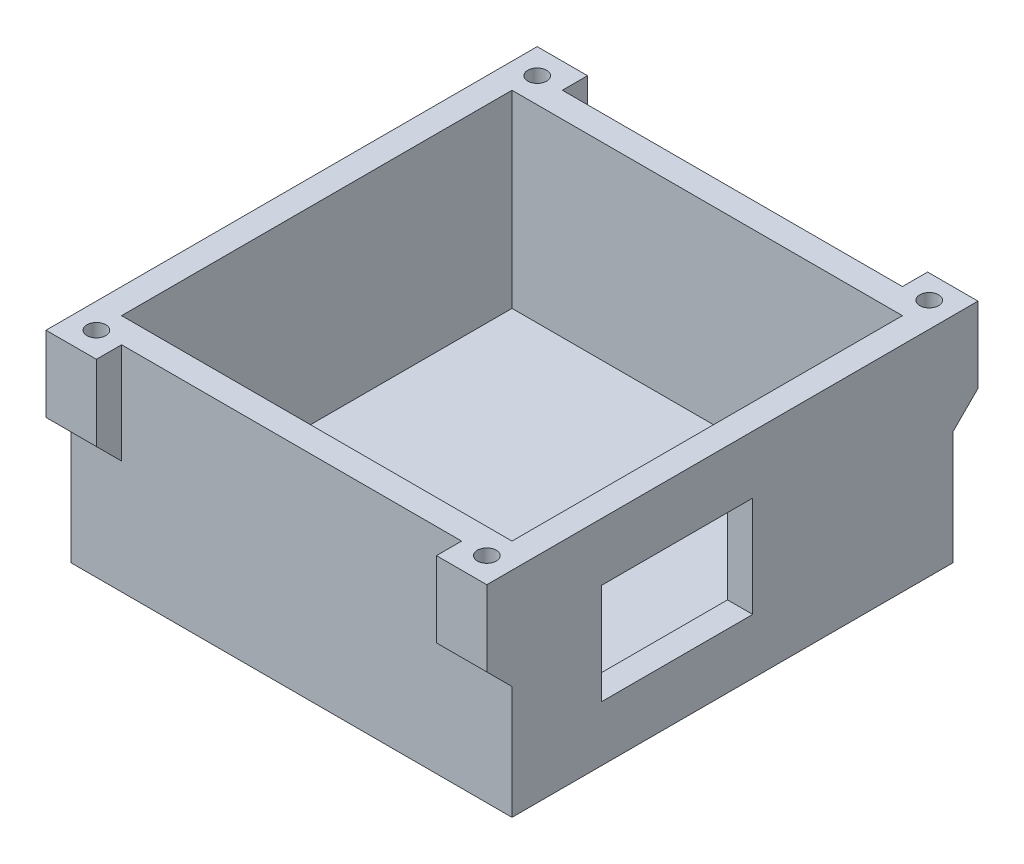
ISO-10303-21;
HEADER;
FILE_DESCRIPTION(('STEP AP214'),'2;1');
FILE_NAME('part.step','',(''),(''),'','','');
FILE_SCHEMA(('AUTOMOTIVE_DESIGN { 1 0 10303 214 1 1 1 1 }'));
ENDSEC;
DATA;
#1=APPLICATION_CONTEXT('core data for automotive mechanical design processes');
#2=APPLICATION_PROTOCOL_DEFINITION('international standard','automotive_design',2000,#1);
#3=PRODUCT_CONTEXT('',#1,'mechanical');
#4=PRODUCT('Part','Part','',(#3));
#5=PRODUCT_RELATED_PRODUCT_CATEGORY('part','',(#4));
#6=PRODUCT_DEFINITION_FORMATION('','',#4);
#7=PRODUCT_DEFINITION_CONTEXT('part definition',#1,'design');
#8=PRODUCT_DEFINITION('design','',#6,#7);
#9=PRODUCT_DEFINITION_SHAPE('','',#8);
#10=(LENGTH_UNIT() NAMED_UNIT(*) SI_UNIT(.MILLI.,.METRE.));
#11=(NAMED_UNIT(*) PLANE_ANGLE_UNIT() SI_UNIT($,.RADIAN.));
#12=(NAMED_UNIT(*) SI_UNIT($,.STERADIAN.) SOLID_ANGLE_UNIT());
#13=UNCERTAINTY_MEASURE_WITH_UNIT(LENGTH_MEASURE(1.E-05),#10,'distance_accuracy_value','');
#14=(GEOMETRIC_REPRESENTATION_CONTEXT(3) GLOBAL_UNCERTAINTY_ASSIGNED_CONTEXT((#13)) GLOBAL_UNIT_ASSIGNED_CONTEXT((#10,
#11,#12)) REPRESENTATION_CONTEXT('',''));
#15=CARTESIAN_POINT('',(0.,0.,0.));
#16=DIRECTION('',(0.,0.,1.));
#17=DIRECTION('',(1.,0.,0.));
#18=AXIS2_PLACEMENT_3D('',#15,#16,#17);
#19=CARTESIAN_POINT('',(0.,2.,2.));
#20=DIRECTION('',(0.,0.,-1.));
#21=DIRECTION('',(-1.,0.,0.));
#22=AXIS2_PLACEMENT_3D('',#19,#20,#21);
#23=PLANE('',#22);
#24=DIRECTION('',(0.,-1.,0.));
#25=VECTOR('',#24,1.);
#26=CARTESIAN_POINT('',(33.,2.,2.));
#27=LINE('',#26,#25);
#28=CARTESIAN_POINT('',(33.,9.00000000000001,2.));
#29=VERTEX_POINT('',#28);
#30=CARTESIAN_POINT('',(33.,0.,2.));
#31=VERTEX_POINT('',#30);
#32=EDGE_CURVE('E431',#29,#31,#27,.T.);
#33=ORIENTED_EDGE('',*,*,#32,.F.);
#34=DIRECTION('',(-1.,0.,0.));
#35=VECTOR('',#34,1.);
#36=CARTESIAN_POINT('',(29.,9.00000000000001,2.));
#37=LINE('',#36,#35);
#38=CARTESIAN_POINT('',(29.,9.00000000000001,2.));
#39=VERTEX_POINT('',#38);
#40=EDGE_CURVE('E453',#29,#39,#37,.T.);
#41=ORIENTED_EDGE('',*,*,#40,.T.);
#42=DIRECTION('',(0.,1.,0.));
#43=VECTOR('',#42,1.);
#44=CARTESIAN_POINT('',(29.,11.,2.));
#45=LINE('',#44,#43);
#46=CARTESIAN_POINT('',(29.,17.,2.));
#47=VERTEX_POINT('',#46);
#48=EDGE_CURVE('E216',#39,#47,#45,.T.);
#49=ORIENTED_EDGE('',*,*,#48,.T.);
#50=DIRECTION('',(1.,0.,0.));
#51=VECTOR('',#50,1.);
#52=CARTESIAN_POINT('',(-2.,17.,2.));
#53=LINE('',#52,#51);
#54=CARTESIAN_POINT('',(2.,17.,2.));
#55=VERTEX_POINT('',#54);
#56=EDGE_CURVE('E369',#55,#47,#53,.T.);
#57=ORIENTED_EDGE('',*,*,#56,.F.);
#58=DIRECTION('',(0.,1.,0.));
#59=VECTOR('',#58,1.);
#60=CARTESIAN_POINT('',(2.,11.,2.));
#61=LINE('',#60,#59);
#62=CARTESIAN_POINT('',(2.,9.00000000000001,2.));
#63=VERTEX_POINT('',#62);
#64=EDGE_CURVE('E259',#63,#55,#61,.T.);
#65=ORIENTED_EDGE('',*,*,#64,.F.);
#66=DIRECTION('',(-1.,0.,0.));
#67=VECTOR('',#66,1.);
#68=CARTESIAN_POINT('',(-2.,9.00000000000001,2.));
#69=LINE('',#68,#67);
#70=CARTESIAN_POINT('',(-2.,9.00000000000001,2.));
#71=VERTEX_POINT('',#70);
#72=EDGE_CURVE('E450',#63,#71,#69,.T.);
#73=ORIENTED_EDGE('',*,*,#72,.T.);
#74=DIRECTION('',(0.,-1.,0.));
#75=VECTOR('',#74,1.);
#76=CARTESIAN_POINT('',(-2.,2.,2.));
#77=LINE('',#76,#75);
#78=CARTESIAN_POINT('',(-2.,0.,2.));
#79=VERTEX_POINT('',#78);
#80=EDGE_CURVE('E434',#71,#79,#77,.T.);
#81=ORIENTED_EDGE('',*,*,#80,.T.);
#82=DIRECTION('',(1.,0.,0.));
#83=VECTOR('',#82,1.);
#84=CARTESIAN_POINT('',(0.,0.,2.));
#85=LINE('',#84,#83);
#86=EDGE_CURVE('E413',#79,#31,#85,.T.);
#87=ORIENTED_EDGE('',*,*,#86,.T.);
#88=EDGE_LOOP('',(#33,#41,#49,#57,#65,#73,#81,#87));
#89=FACE_BOUND('',#88,.T.);
#90=ADVANCED_FACE('F49',(#89),#23,.F.);
#91=CARTESIAN_POINT('',(-2.,2.,0.));
#92=DIRECTION('',(-1.,0.,0.));
#93=DIRECTION('',(0.,0.,1.));
#94=AXIS2_PLACEMENT_3D('',#91,#92,#93);
#95=PLANE('',#94);
#96=DIRECTION('',(0.,0.,-1.));
#97=VECTOR('',#96,1.);
#98=CARTESIAN_POINT('',(-2.,0.,0.));
#99=LINE('',#98,#97);
#100=CARTESIAN_POINT('',(-2.,0.,-33.));
#101=VERTEX_POINT('',#100);
#102=EDGE_CURVE('E409',#79,#101,#99,.T.);
#103=ORIENTED_EDGE('',*,*,#102,.F.);
#104=ORIENTED_EDGE('',*,*,#80,.F.);
#105=DIRECTION('',(0.,-0.707106781186544,-0.707106781186551));
#106=VECTOR('',#105,1.);
#107=CARTESIAN_POINT('',(-2.,11.,4.00000000000002));
#108=LINE('',#107,#106);
#109=CARTESIAN_POINT('',(-2.,11.,4.));
#110=VERTEX_POINT('',#109);
#111=EDGE_CURVE('E467',#71,#110,#108,.F.);
#112=ORIENTED_EDGE('',*,*,#111,.T.);
#113=DIRECTION('',(0.,1.,0.));
#114=VECTOR('',#113,1.);
#115=CARTESIAN_POINT('',(-2.,11.,4.));
#116=LINE('',#115,#114);
#117=CARTESIAN_POINT('',(-2.,17.,4.));
#118=VERTEX_POINT('',#117);
#119=EDGE_CURVE('E271',#110,#118,#116,.T.);
#120=ORIENTED_EDGE('',*,*,#119,.T.);
#121=DIRECTION('',(0.,0.,1.));
#122=VECTOR('',#121,1.);
#123=CARTESIAN_POINT('',(-2.,17.,2.));
#124=LINE('',#123,#122);
#125=CARTESIAN_POINT('',(-2.,17.,-35.));
#126=VERTEX_POINT('',#125);
#127=EDGE_CURVE('E359',#126,#118,#124,.T.);
#128=ORIENTED_EDGE('',*,*,#127,.F.);
#129=DIRECTION('',(0.,1.,0.));
#130=VECTOR('',#129,1.);
#131=CARTESIAN_POINT('',(-2.,11.,-35.));
#132=LINE('',#131,#130);
#133=CARTESIAN_POINT('',(-2.,11.,-35.));
#134=VERTEX_POINT('',#133);
#135=EDGE_CURVE('E289',#134,#126,#132,.T.);
#136=ORIENTED_EDGE('',*,*,#135,.F.);
#137=DIRECTION('',(0.,-0.707106781186544,0.707106781186551));
#138=VECTOR('',#137,1.);
#139=CARTESIAN_POINT('',(-2.,11.,-35.));
#140=LINE('',#139,#138);
#141=CARTESIAN_POINT('',(-2.,9.00000000000001,-33.));
#142=VERTEX_POINT('',#141);
#143=EDGE_CURVE('E470',#134,#142,#140,.T.);
#144=ORIENTED_EDGE('',*,*,#143,.T.);
#145=DIRECTION('',(0.,-1.,0.));
#146=VECTOR('',#145,1.);
#147=CARTESIAN_POINT('',(-2.,2.,-33.));
#148=LINE('',#147,#146);
#149=EDGE_CURVE('E425',#142,#101,#148,.T.);
#150=ORIENTED_EDGE('',*,*,#149,.T.);
#151=EDGE_LOOP('',(#103,#104,#112,#120,#128,#136,#144,#150));
#152=FACE_BOUND('',#151,.T.);
#153=ADVANCED_FACE('F517',(#152),#95,.T.);
#154=CARTESIAN_POINT('',(33.,2.,0.));
#155=DIRECTION('',(-1.,0.,0.));
#156=DIRECTION('',(0.,0.,1.));
#157=AXIS2_PLACEMENT_3D('',#154,#155,#156);
#158=PLANE('',#157);
#159=DIRECTION('',(0.,0.,-1.));
#160=VECTOR('',#159,1.);
#161=CARTESIAN_POINT('',(33.,4.4,-5.11130328259669));
#162=LINE('',#161,#160);
#163=CARTESIAN_POINT('',(33.,4.4,-5.11130328259669));
#164=VERTEX_POINT('',#163);
#165=CARTESIAN_POINT('',(33.,4.4,-17.1113032825967));
#166=VERTEX_POINT('',#165);
#167=EDGE_CURVE('E322',#164,#166,#162,.T.);
#168=ORIENTED_EDGE('',*,*,#167,.F.);
#169=DIRECTION('',(0.,-1.,0.));
#170=VECTOR('',#169,1.);
#171=CARTESIAN_POINT('',(33.,12.4,-5.11130328259669));
#172=LINE('',#171,#170);
#173=CARTESIAN_POINT('',(33.,12.4,-5.11130328259669));
#174=VERTEX_POINT('',#173);
#175=EDGE_CURVE('E313',#174,#164,#172,.T.);
#176=ORIENTED_EDGE('',*,*,#175,.F.);
#177=DIRECTION('',(0.,0.,1.));
#178=VECTOR('',#177,1.);
#179=CARTESIAN_POINT('',(33.,12.4,-5.11130328259669));
#180=LINE('',#179,#178);
#181=CARTESIAN_POINT('',(33.,12.4,-17.1113032825967));
#182=VERTEX_POINT('',#181);
#183=EDGE_CURVE('E330',#182,#174,#180,.T.);
#184=ORIENTED_EDGE('',*,*,#183,.F.);
#185=DIRECTION('',(0.,1.,0.));
#186=VECTOR('',#185,1.);
#187=CARTESIAN_POINT('',(33.,12.4,-17.1113032825967));
#188=LINE('',#187,#186);
#189=EDGE_CURVE('E326',#166,#182,#188,.T.);
#190=ORIENTED_EDGE('',*,*,#189,.F.);
#191=EDGE_LOOP('',(#168,#176,#184,#190));
#192=FACE_BOUND('',#191,.T.);
#193=DIRECTION('',(0.,0.,-1.));
#194=VECTOR('',#193,1.);
#195=CARTESIAN_POINT('',(33.,0.,0.));
#196=LINE('',#195,#194);
#197=CARTESIAN_POINT('',(33.,0.,-33.));
#198=VERTEX_POINT('',#197);
#199=EDGE_CURVE('E417',#31,#198,#196,.T.);
#200=ORIENTED_EDGE('',*,*,#199,.T.);
#201=DIRECTION('',(0.,-1.,0.));
#202=VECTOR('',#201,1.);
#203=CARTESIAN_POINT('',(33.,2.,-33.));
#204=LINE('',#203,#202);
#205=CARTESIAN_POINT('',(33.,9.00000000000001,-33.));
#206=VERTEX_POINT('',#205);
#207=EDGE_CURVE('E428',#206,#198,#204,.T.);
#208=ORIENTED_EDGE('',*,*,#207,.F.);
#209=DIRECTION('',(0.,0.707106781186544,-0.707106781186551));
#210=VECTOR('',#209,1.);
#211=CARTESIAN_POINT('',(33.,-11.,-12.9999999999998));
#212=LINE('',#211,#210);
#213=CARTESIAN_POINT('',(33.,11.,-35.));
#214=VERTEX_POINT('',#213);
#215=EDGE_CURVE('E12',#206,#214,#212,.T.);
#216=ORIENTED_EDGE('',*,*,#215,.T.);
#217=DIRECTION('',(0.,1.,0.));
#218=VECTOR('',#217,1.);
#219=CARTESIAN_POINT('',(33.,11.,-35.));
#220=LINE('',#219,#218);
#221=CARTESIAN_POINT('',(33.,17.,-35.));
#222=VERTEX_POINT('',#221);
#223=EDGE_CURVE('E314',#214,#222,#220,.T.);
#224=ORIENTED_EDGE('',*,*,#223,.T.);
#225=DIRECTION('',(0.,0.,-1.));
#226=VECTOR('',#225,1.);
#227=CARTESIAN_POINT('',(33.,17.,2.));
#228=LINE('',#227,#226);
#229=CARTESIAN_POINT('',(33.,17.,4.));
#230=VERTEX_POINT('',#229);
#231=EDGE_CURVE('E366',#230,#222,#228,.T.);
#232=ORIENTED_EDGE('',*,*,#231,.F.);
#233=DIRECTION('',(0.,1.,0.));
#234=VECTOR('',#233,1.);
#235=CARTESIAN_POINT('',(33.,11.,4.));
#236=LINE('',#235,#234);
#237=CARTESIAN_POINT('',(33.,11.,4.));
#238=VERTEX_POINT('',#237);
#239=EDGE_CURVE('E234',#238,#230,#236,.T.);
#240=ORIENTED_EDGE('',*,*,#239,.F.);
#241=DIRECTION('',(0.,0.707106781186544,0.707106781186551));
#242=VECTOR('',#241,1.);
#243=CARTESIAN_POINT('',(33.,4.50000000000004,-2.50000000000002));
#244=LINE('',#243,#242);
#245=EDGE_CURVE('E223',#238,#29,#244,.F.);
#246=ORIENTED_EDGE('',*,*,#245,.T.);
#247=ORIENTED_EDGE('',*,*,#32,.T.);
#248=EDGE_LOOP('',(#200,#208,#216,#224,#232,#240,#246,#247));
#249=FACE_BOUND('',#248,.T.);
#250=ADVANCED_FACE('F489',(#192,#249),#158,.F.);
#251=CARTESIAN_POINT('',(0.,2.,-33.));
#252=DIRECTION('',(0.,0.,-1.));
#253=DIRECTION('',(-1.,0.,0.));
#254=AXIS2_PLACEMENT_3D('',#251,#252,#253);
#255=PLANE('',#254);
#256=ORIENTED_EDGE('',*,*,#149,.F.);
#257=DIRECTION('',(1.,0.,0.));
#258=VECTOR('',#257,1.);
#259=CARTESIAN_POINT('',(0.,9.00000000000001,-33.));
#260=LINE('',#259,#258);
#261=CARTESIAN_POINT('',(2.,9.00000000000001,-33.));
#262=VERTEX_POINT('',#261);
#263=EDGE_CURVE('E459',#142,#262,#260,.T.);
#264=ORIENTED_EDGE('',*,*,#263,.T.);
#265=DIRECTION('',(0.,1.,0.));
#266=VECTOR('',#265,1.);
#267=CARTESIAN_POINT('',(2.,11.,-33.));
#268=LINE('',#267,#266);
#269=CARTESIAN_POINT('',(2.,17.,-33.));
#270=VERTEX_POINT('',#269);
#271=EDGE_CURVE('E66',#262,#270,#268,.T.);
#272=ORIENTED_EDGE('',*,*,#271,.T.);
#273=DIRECTION('',(-1.,0.,0.));
#274=VECTOR('',#273,1.);
#275=CARTESIAN_POINT('',(-2.,17.,-33.));
#276=LINE('',#275,#274);
#277=CARTESIAN_POINT('',(29.,17.,-33.));
#278=VERTEX_POINT('',#277);
#279=EDGE_CURVE('E362',#278,#270,#276,.T.);
#280=ORIENTED_EDGE('',*,*,#279,.F.);
#281=DIRECTION('',(0.,1.,0.));
#282=VECTOR('',#281,1.);
#283=CARTESIAN_POINT('',(29.,11.,-33.));
#284=LINE('',#283,#282);
#285=CARTESIAN_POINT('',(29.,9.00000000000001,-33.));
#286=VERTEX_POINT('',#285);
#287=EDGE_CURVE('E74',#286,#278,#284,.T.);
#288=ORIENTED_EDGE('',*,*,#287,.F.);
#289=DIRECTION('',(1.,0.,0.));
#290=VECTOR('',#289,1.);
#291=CARTESIAN_POINT('',(0.,9.00000000000001,-33.));
#292=LINE('',#291,#290);
#293=EDGE_CURVE('E456',#286,#206,#292,.T.);
#294=ORIENTED_EDGE('',*,*,#293,.T.);
#295=ORIENTED_EDGE('',*,*,#207,.T.);
#296=DIRECTION('',(1.,0.,0.));
#297=VECTOR('',#296,1.);
#298=CARTESIAN_POINT('',(0.,0.,-33.));
#299=LINE('',#298,#297);
#300=EDGE_CURVE('E421',#101,#198,#299,.T.);
#301=ORIENTED_EDGE('',*,*,#300,.F.);
#302=EDGE_LOOP('',(#256,#264,#272,#280,#288,#294,#295,#301));
#303=FACE_BOUND('',#302,.T.);
#304=ADVANCED_FACE('F486',(#303),#255,.T.);
#305=CARTESIAN_POINT('',(0.,0.,0.));
#306=DIRECTION('',(0.,1.,0.));
#307=DIRECTION('',(0.,0.,1.));
#308=AXIS2_PLACEMENT_3D('',#305,#306,#307);
#309=PLANE('',#308);
#310=ORIENTED_EDGE('',*,*,#102,.T.);
#311=ORIENTED_EDGE('',*,*,#300,.T.);
#312=ORIENTED_EDGE('',*,*,#199,.F.);
#313=ORIENTED_EDGE('',*,*,#86,.F.);
#314=EDGE_LOOP('',(#310,#311,#312,#313));
#315=FACE_BOUND('',#314,.T.);
#316=ADVANCED_FACE('F495',(#315),#309,.F.);
#317=CARTESIAN_POINT('',(0.,81.4974746830583,-31.));
#318=DIRECTION('',(0.,0.,1.));
#319=DIRECTION('',(1.,0.,0.));
#320=AXIS2_PLACEMENT_3D('',#317,#318,#319);
#321=PLANE('',#320);
#322=DIRECTION('',(0.,-1.,0.));
#323=VECTOR('',#322,1.);
#324=CARTESIAN_POINT('',(0.,81.4974746830583,-31.));
#325=LINE('',#324,#323);
#326=CARTESIAN_POINT('',(0.,17.,-31.));
#327=VERTEX_POINT('',#326);
#328=CARTESIAN_POINT('',(0.,2.00000000000003,-31.));
#329=VERTEX_POINT('',#328);
#330=EDGE_CURVE('E373',#327,#329,#325,.T.);
#331=ORIENTED_EDGE('',*,*,#330,.T.);
#332=DIRECTION('',(1.,0.,0.));
#333=VECTOR('',#332,1.);
#334=CARTESIAN_POINT('',(0.,2.,-31.));
#335=LINE('',#334,#333);
#336=CARTESIAN_POINT('',(31.,2.,-31.));
#337=VERTEX_POINT('',#336);
#338=EDGE_CURVE('E405',#329,#337,#335,.T.);
#339=ORIENTED_EDGE('',*,*,#338,.T.);
#340=DIRECTION('',(0.,-1.,0.));
#341=VECTOR('',#340,1.);
#342=CARTESIAN_POINT('',(31.,81.4974746830583,-31.));
#343=LINE('',#342,#341);
#344=CARTESIAN_POINT('',(31.,17.,-31.));
#345=VERTEX_POINT('',#344);
#346=EDGE_CURVE('E377',#345,#337,#343,.T.);
#347=ORIENTED_EDGE('',*,*,#346,.F.);
#348=DIRECTION('',(-1.,0.,0.));
#349=VECTOR('',#348,1.);
#350=CARTESIAN_POINT('',(0.,17.,-31.));
#351=LINE('',#350,#349);
#352=EDGE_CURVE('E389',#345,#327,#351,.T.);
#353=ORIENTED_EDGE('',*,*,#352,.T.);
#354=EDGE_LOOP('',(#331,#339,#347,#353));
#355=FACE_BOUND('',#354,.T.);
#356=ADVANCED_FACE('F844',(#355),#321,.T.);
#357=CARTESIAN_POINT('',(31.,81.4974746830583,0.));
#358=DIRECTION('',(-1.,0.,0.));
#359=DIRECTION('',(0.,0.,1.));
#360=AXIS2_PLACEMENT_3D('',#357,#358,#359);
#361=PLANE('',#360);
#362=DIRECTION('',(0.,1.,0.));
#363=VECTOR('',#362,1.);
#364=CARTESIAN_POINT('',(31.,81.4974746830583,-5.11130328259669));
#365=LINE('',#364,#363);
#366=CARTESIAN_POINT('',(31.,4.4,-5.11130328259669));
#367=VERTEX_POINT('',#366);
#368=CARTESIAN_POINT('',(31.,12.4,-5.11130328259669));
#369=VERTEX_POINT('',#368);
#370=EDGE_CURVE('E447',#367,#369,#365,.T.);
#371=ORIENTED_EDGE('',*,*,#370,.F.);
#372=DIRECTION('',(0.,0.,1.));
#373=VECTOR('',#372,1.);
#374=CARTESIAN_POINT('',(31.,4.4,0.));
#375=LINE('',#374,#373);
#376=CARTESIAN_POINT('',(31.,4.4,-17.1113032825967));
#377=VERTEX_POINT('',#376);
#378=EDGE_CURVE('E437',#377,#367,#375,.T.);
#379=ORIENTED_EDGE('',*,*,#378,.F.);
#380=DIRECTION('',(0.,-1.,0.));
#381=VECTOR('',#380,1.);
#382=CARTESIAN_POINT('',(31.,81.4974746830583,-17.1113032825967));
#383=LINE('',#382,#381);
#384=CARTESIAN_POINT('',(31.,12.4,-17.1113032825967));
#385=VERTEX_POINT('',#384);
#386=EDGE_CURVE('E440',#385,#377,#383,.T.);
#387=ORIENTED_EDGE('',*,*,#386,.F.);
#388=DIRECTION('',(0.,0.,-1.));
#389=VECTOR('',#388,1.);
#390=CARTESIAN_POINT('',(31.,12.4,0.));
#391=LINE('',#390,#389);
#392=EDGE_CURVE('E444',#369,#385,#391,.T.);
#393=ORIENTED_EDGE('',*,*,#392,.F.);
#394=EDGE_LOOP('',(#371,#379,#387,#393));
#395=FACE_BOUND('',#394,.T.);
#396=ORIENTED_EDGE('',*,*,#346,.T.);
#397=DIRECTION('',(0.,0.,1.));
#398=VECTOR('',#397,1.);
#399=CARTESIAN_POINT('',(31.,2.,0.));
#400=LINE('',#399,#398);
#401=CARTESIAN_POINT('',(31.,2.,0.));
#402=VERTEX_POINT('',#401);
#403=EDGE_CURVE('E401',#337,#402,#400,.T.);
#404=ORIENTED_EDGE('',*,*,#403,.T.);
#405=DIRECTION('',(0.,-1.,0.));
#406=VECTOR('',#405,1.);
#407=CARTESIAN_POINT('',(31.,81.4974746830583,0.));
#408=LINE('',#407,#406);
#409=CARTESIAN_POINT('',(31.,17.,0.));
#410=VERTEX_POINT('',#409);
#411=EDGE_CURVE('E381',#410,#402,#408,.T.);
#412=ORIENTED_EDGE('',*,*,#411,.F.);
#413=DIRECTION('',(0.,0.,-1.));
#414=VECTOR('',#413,1.);
#415=CARTESIAN_POINT('',(31.,17.,0.));
#416=LINE('',#415,#414);
#417=EDGE_CURVE('E338',#410,#345,#416,.T.);
#418=ORIENTED_EDGE('',*,*,#417,.T.);
#419=EDGE_LOOP('',(#396,#404,#412,#418));
#420=FACE_BOUND('',#419,.T.);
#421=ADVANCED_FACE('F834',(#395,#420),#361,.T.);
#422=CARTESIAN_POINT('',(0.,81.4974746830583,0.));
#423=DIRECTION('',(0.,0.,-1.));
#424=DIRECTION('',(-1.,0.,0.));
#425=AXIS2_PLACEMENT_3D('',#422,#423,#424);
#426=PLANE('',#425);
#427=ORIENTED_EDGE('',*,*,#411,.T.);
#428=DIRECTION('',(-1.,0.,0.));
#429=VECTOR('',#428,1.);
#430=CARTESIAN_POINT('',(0.,2.,0.));
#431=LINE('',#430,#429);
#432=CARTESIAN_POINT('',(0.,2.,0.));
#433=VERTEX_POINT('',#432);
#434=EDGE_CURVE('E397',#402,#433,#431,.T.);
#435=ORIENTED_EDGE('',*,*,#434,.T.);
#436=DIRECTION('',(0.,-1.,0.));
#437=VECTOR('',#436,1.);
#438=CARTESIAN_POINT('',(0.,81.4974746830583,0.));
#439=LINE('',#438,#437);
#440=CARTESIAN_POINT('',(0.,17.,0.));
#441=VERTEX_POINT('',#440);
#442=EDGE_CURVE('E385',#441,#433,#439,.T.);
#443=ORIENTED_EDGE('',*,*,#442,.F.);
#444=DIRECTION('',(1.,0.,0.));
#445=VECTOR('',#444,1.);
#446=CARTESIAN_POINT('',(0.,17.,0.));
#447=LINE('',#446,#445);
#448=EDGE_CURVE('E351',#441,#410,#447,.T.);
#449=ORIENTED_EDGE('',*,*,#448,.T.);
#450=EDGE_LOOP('',(#427,#435,#443,#449));
#451=FACE_BOUND('',#450,.T.);
#452=ADVANCED_FACE('F824',(#451),#426,.T.);
#453=CARTESIAN_POINT('',(0.,81.4974746830583,0.));
#454=DIRECTION('',(1.,0.,0.));
#455=DIRECTION('',(0.,0.,-1.));
#456=AXIS2_PLACEMENT_3D('',#453,#454,#455);
#457=PLANE('',#456);
#458=ORIENTED_EDGE('',*,*,#442,.T.);
#459=DIRECTION('',(0.,0.,-1.));
#460=VECTOR('',#459,1.);
#461=CARTESIAN_POINT('',(0.,2.,0.));
#462=LINE('',#461,#460);
#463=EDGE_CURVE('E393',#433,#329,#462,.T.);
#464=ORIENTED_EDGE('',*,*,#463,.T.);
#465=ORIENTED_EDGE('',*,*,#330,.F.);
#466=DIRECTION('',(0.,0.,1.));
#467=VECTOR('',#466,1.);
#468=CARTESIAN_POINT('',(0.,17.,0.));
#469=LINE('',#468,#467);
#470=EDGE_CURVE('E355',#327,#441,#469,.T.);
#471=ORIENTED_EDGE('',*,*,#470,.T.);
#472=EDGE_LOOP('',(#458,#464,#465,#471));
#473=FACE_BOUND('',#472,.T.);
#474=ADVANCED_FACE('F617',(#473),#457,.T.);
#475=CARTESIAN_POINT('',(0.,17.,0.));
#476=DIRECTION('',(0.,1.,0.));
#477=DIRECTION('',(0.,0.,1.));
#478=AXIS2_PLACEMENT_3D('',#475,#476,#477);
#479=PLANE('',#478);
#480=CARTESIAN_POINT('',(0.,17.,-33.));
#481=DIRECTION('',(0.,1.,0.));
#482=DIRECTION('',(0.,0.,1.));
#483=AXIS2_PLACEMENT_3D('',#480,#481,#482);
#484=CIRCLE('',#483,0.75);
#485=CARTESIAN_POINT('',(0.,17.,-32.25));
#486=VERTEX_POINT('',#485);
#487=EDGE_CURVE('E982',#486,#486,#484,.T.);
#488=ORIENTED_EDGE('',*,*,#487,.F.);
#489=EDGE_LOOP('',(#488));
#490=FACE_BOUND('',#489,.T.);
#491=CARTESIAN_POINT('',(0.,17.,2.));
#492=DIRECTION('',(0.,1.,0.));
#493=DIRECTION('',(0.,0.,1.));
#494=AXIS2_PLACEMENT_3D('',#491,#492,#493);
#495=CIRCLE('',#494,0.75);
#496=CARTESIAN_POINT('',(0.,17.,2.75));
#497=VERTEX_POINT('',#496);
#498=EDGE_CURVE('E1003',#497,#497,#495,.T.);
#499=ORIENTED_EDGE('',*,*,#498,.F.);
#500=EDGE_LOOP('',(#499));
#501=FACE_BOUND('',#500,.T.);
#502=CARTESIAN_POINT('',(31.,17.,2.));
#503=DIRECTION('',(0.,1.,0.));
#504=DIRECTION('',(0.,0.,1.));
#505=AXIS2_PLACEMENT_3D('',#502,#503,#504);
#506=CIRCLE('',#505,0.749999999999999);
#507=CARTESIAN_POINT('',(31.,17.,2.75));
#508=VERTEX_POINT('',#507);
#509=EDGE_CURVE('E993',#508,#508,#506,.T.);
#510=ORIENTED_EDGE('',*,*,#509,.F.);
#511=EDGE_LOOP('',(#510));
#512=FACE_BOUND('',#511,.T.);
#513=CARTESIAN_POINT('',(31.,17.,-33.1225389241289));
#514=DIRECTION('',(0.,1.,0.));
#515=DIRECTION('',(0.,0.,1.));
#516=AXIS2_PLACEMENT_3D('',#513,#514,#515);
#517=CIRCLE('',#516,0.749999999999992);
#518=CARTESIAN_POINT('',(31.,17.,-32.3725389241289));
#519=VERTEX_POINT('',#518);
#520=EDGE_CURVE('E247',#519,#519,#517,.T.);
#521=ORIENTED_EDGE('',*,*,#520,.F.);
#522=EDGE_LOOP('',(#521));
#523=FACE_BOUND('',#522,.T.);
#524=ORIENTED_EDGE('',*,*,#470,.F.);
#525=ORIENTED_EDGE('',*,*,#352,.F.);
#526=ORIENTED_EDGE('',*,*,#417,.F.);
#527=ORIENTED_EDGE('',*,*,#448,.F.);
#528=EDGE_LOOP('',(#524,#525,#526,#527));
#529=FACE_BOUND('',#528,.T.);
#530=ORIENTED_EDGE('',*,*,#127,.T.);
#531=DIRECTION('',(1.,0.,0.));
#532=VECTOR('',#531,1.);
#533=CARTESIAN_POINT('',(0.,17.,4.));
#534=LINE('',#533,#532);
#535=CARTESIAN_POINT('',(2.,17.,4.));
#536=VERTEX_POINT('',#535);
#537=EDGE_CURVE('E260',#118,#536,#534,.T.);
#538=ORIENTED_EDGE('',*,*,#537,.T.);
#539=DIRECTION('',(0.,0.,1.));
#540=VECTOR('',#539,1.);
#541=CARTESIAN_POINT('',(2.,17.,0.));
#542=LINE('',#541,#540);
#543=EDGE_CURVE('E253',#55,#536,#542,.T.);
#544=ORIENTED_EDGE('',*,*,#543,.F.);
#545=ORIENTED_EDGE('',*,*,#56,.T.);
#546=DIRECTION('',(0.,0.,1.));
#547=VECTOR('',#546,1.);
#548=CARTESIAN_POINT('',(29.,17.,0.));
#549=LINE('',#548,#547);
#550=CARTESIAN_POINT('',(29.,17.,4.));
#551=VERTEX_POINT('',#550);
#552=EDGE_CURVE('E243',#47,#551,#549,.T.);
#553=ORIENTED_EDGE('',*,*,#552,.T.);
#554=DIRECTION('',(-1.,0.,0.));
#555=VECTOR('',#554,1.);
#556=CARTESIAN_POINT('',(0.,17.,4.00000000000001));
#557=LINE('',#556,#555);
#558=EDGE_CURVE('E231',#230,#551,#557,.T.);
#559=ORIENTED_EDGE('',*,*,#558,.F.);
#560=ORIENTED_EDGE('',*,*,#231,.T.);
#561=DIRECTION('',(-1.,0.,0.));
#562=VECTOR('',#561,1.);
#563=CARTESIAN_POINT('',(0.,17.,-35.));
#564=LINE('',#563,#562);
#565=CARTESIAN_POINT('',(29.,17.,-35.));
#566=VERTEX_POINT('',#565);
#567=EDGE_CURVE('E303',#222,#566,#564,.T.);
#568=ORIENTED_EDGE('',*,*,#567,.T.);
#569=DIRECTION('',(0.,0.,-1.));
#570=VECTOR('',#569,1.);
#571=CARTESIAN_POINT('',(29.,17.,0.));
#572=LINE('',#571,#570);
#573=EDGE_CURVE('E293',#278,#566,#572,.T.);
#574=ORIENTED_EDGE('',*,*,#573,.F.);
#575=ORIENTED_EDGE('',*,*,#279,.T.);
#576=DIRECTION('',(0.,0.,-1.));
#577=VECTOR('',#576,1.);
#578=CARTESIAN_POINT('',(2.,17.,0.));
#579=LINE('',#578,#577);
#580=CARTESIAN_POINT('',(2.,17.,-35.));
#581=VERTEX_POINT('',#580);
#582=EDGE_CURVE('E270',#270,#581,#579,.T.);
#583=ORIENTED_EDGE('',*,*,#582,.T.);
#584=DIRECTION('',(1.,0.,0.));
#585=VECTOR('',#584,1.);
#586=CARTESIAN_POINT('',(0.,17.,-35.));
#587=LINE('',#586,#585);
#588=EDGE_CURVE('E282',#126,#581,#587,.T.);
#589=ORIENTED_EDGE('',*,*,#588,.F.);
#590=EDGE_LOOP('',(#530,#538,#544,#545,#553,#559,#560,#568,#574,#575,#583,#589));
#591=FACE_BOUND('',#590,.T.);
#592=ADVANCED_FACE('F510',(#490,#501,#512,#523,#529,#591),#479,.T.);
#593=CARTESIAN_POINT('',(0.,2.,0.));
#594=DIRECTION('',(0.,1.,0.));
#595=DIRECTION('',(0.,0.,1.));
#596=AXIS2_PLACEMENT_3D('',#593,#594,#595);
#597=PLANE('',#596);
#598=ORIENTED_EDGE('',*,*,#338,.F.);
#599=ORIENTED_EDGE('',*,*,#463,.F.);
#600=ORIENTED_EDGE('',*,*,#434,.F.);
#601=ORIENTED_EDGE('',*,*,#403,.F.);
#602=EDGE_LOOP('',(#598,#599,#600,#601));
#603=FACE_BOUND('',#602,.T.);
#604=ADVANCED_FACE('F616',(#603),#597,.T.);
#605=CARTESIAN_POINT('',(18.,12.4,-5.11130328259669));
#606=DIRECTION('',(0.,0.,1.));
#607=DIRECTION('',(1.,0.,0.));
#608=AXIS2_PLACEMENT_3D('',#605,#606,#607);
#609=PLANE('',#608);
#610=ORIENTED_EDGE('',*,*,#370,.T.);
#611=DIRECTION('',(1.,0.,0.));
#612=VECTOR('',#611,1.);
#613=CARTESIAN_POINT('',(18.,12.4,-5.11130328259669));
#614=LINE('',#613,#612);
#615=EDGE_CURVE('E335',#369,#174,#614,.T.);
#616=ORIENTED_EDGE('',*,*,#615,.T.);
#617=ORIENTED_EDGE('',*,*,#175,.T.);
#618=DIRECTION('',(1.,0.,0.));
#619=VECTOR('',#618,1.);
#620=CARTESIAN_POINT('',(18.,4.4,-5.11130328259669));
#621=LINE('',#620,#619);
#622=EDGE_CURVE('E334',#367,#164,#621,.T.);
#623=ORIENTED_EDGE('',*,*,#622,.F.);
#624=EDGE_LOOP('',(#610,#616,#617,#623));
#625=FACE_BOUND('',#624,.T.);
#626=ADVANCED_FACE('F800',(#625),#609,.F.);
#627=CARTESIAN_POINT('',(18.,12.4,-5.11130328259669));
#628=DIRECTION('',(0.,1.,0.));
#629=DIRECTION('',(0.,0.,1.));
#630=AXIS2_PLACEMENT_3D('',#627,#628,#629);
#631=PLANE('',#630);
#632=ORIENTED_EDGE('',*,*,#392,.T.);
#633=DIRECTION('',(1.,0.,0.));
#634=VECTOR('',#633,1.);
#635=CARTESIAN_POINT('',(18.,12.4,-17.1113032825967));
#636=LINE('',#635,#634);
#637=EDGE_CURVE('E339',#385,#182,#636,.T.);
#638=ORIENTED_EDGE('',*,*,#637,.T.);
#639=ORIENTED_EDGE('',*,*,#183,.T.);
#640=ORIENTED_EDGE('',*,*,#615,.F.);
#641=EDGE_LOOP('',(#632,#638,#639,#640));
#642=FACE_BOUND('',#641,.T.);
#643=ADVANCED_FACE('F790',(#642),#631,.F.);
#644=CARTESIAN_POINT('',(18.,12.4,-17.1113032825967));
#645=DIRECTION('',(0.,0.,-1.));
#646=DIRECTION('',(-1.,0.,0.));
#647=AXIS2_PLACEMENT_3D('',#644,#645,#646);
#648=PLANE('',#647);
#649=ORIENTED_EDGE('',*,*,#386,.T.);
#650=DIRECTION('',(1.,0.,0.));
#651=VECTOR('',#650,1.);
#652=CARTESIAN_POINT('',(18.,4.4,-17.1113032825967));
#653=LINE('',#652,#651);
#654=EDGE_CURVE('E342',#377,#166,#653,.T.);
#655=ORIENTED_EDGE('',*,*,#654,.T.);
#656=ORIENTED_EDGE('',*,*,#189,.T.);
#657=ORIENTED_EDGE('',*,*,#637,.F.);
#658=EDGE_LOOP('',(#649,#655,#656,#657));
#659=FACE_BOUND('',#658,.T.);
#660=ADVANCED_FACE('F781',(#659),#648,.F.);
#661=CARTESIAN_POINT('',(18.,4.4,-5.11130328259669));
#662=DIRECTION('',(0.,-1.,0.));
#663=DIRECTION('',(0.,0.,-1.));
#664=AXIS2_PLACEMENT_3D('',#661,#662,#663);
#665=PLANE('',#664);
#666=ORIENTED_EDGE('',*,*,#378,.T.);
#667=ORIENTED_EDGE('',*,*,#622,.T.);
#668=ORIENTED_EDGE('',*,*,#167,.T.);
#669=ORIENTED_EDGE('',*,*,#654,.F.);
#670=EDGE_LOOP('',(#666,#667,#668,#669));
#671=FACE_BOUND('',#670,.T.);
#672=ADVANCED_FACE('F762',(#671),#665,.F.);
#673=CARTESIAN_POINT('',(29.,11.,0.));
#674=DIRECTION('',(1.,0.,0.));
#675=DIRECTION('',(0.,0.,-1.));
#676=AXIS2_PLACEMENT_3D('',#673,#674,#675);
#677=PLANE('',#676);
#678=ORIENTED_EDGE('',*,*,#573,.T.);
#679=DIRECTION('',(0.,1.,0.));
#680=VECTOR('',#679,1.);
#681=CARTESIAN_POINT('',(29.,11.,-35.));
#682=LINE('',#681,#680);
#683=CARTESIAN_POINT('',(29.,11.,-35.));
#684=VERTEX_POINT('',#683);
#685=EDGE_CURVE('E310',#684,#566,#682,.T.);
#686=ORIENTED_EDGE('',*,*,#685,.F.);
#687=DIRECTION('',(0.,-0.707106781186544,0.707106781186551));
#688=VECTOR('',#687,1.);
#689=CARTESIAN_POINT('',(29.,-6.50000000000001,-17.4999999999998));
#690=LINE('',#689,#688);
#691=EDGE_CURVE('E59',#684,#286,#690,.T.);
#692=ORIENTED_EDGE('',*,*,#691,.T.);
#693=ORIENTED_EDGE('',*,*,#287,.T.);
#694=EDGE_LOOP('',(#678,#686,#692,#693));
#695=FACE_BOUND('',#694,.T.);
#696=ADVANCED_FACE('F479',(#695),#677,.F.);
#697=CARTESIAN_POINT('',(0.,11.,-35.));
#698=DIRECTION('',(0.,0.,-1.));
#699=DIRECTION('',(-1.,0.,0.));
#700=AXIS2_PLACEMENT_3D('',#697,#698,#699);
#701=PLANE('',#700);
#702=ORIENTED_EDGE('',*,*,#567,.F.);
#703=ORIENTED_EDGE('',*,*,#223,.F.);
#704=DIRECTION('',(-1.,0.,0.));
#705=VECTOR('',#704,1.);
#706=CARTESIAN_POINT('',(0.,11.,-35.));
#707=LINE('',#706,#705);
#708=EDGE_CURVE('E299',#214,#684,#707,.T.);
#709=ORIENTED_EDGE('',*,*,#708,.T.);
#710=ORIENTED_EDGE('',*,*,#685,.T.);
#711=EDGE_LOOP('',(#702,#703,#709,#710));
#712=FACE_BOUND('',#711,.T.);
#713=ADVANCED_FACE('F513',(#712),#701,.T.);
#714=CARTESIAN_POINT('',(0.,11.,-35.));
#715=DIRECTION('',(0.,0.,1.));
#716=DIRECTION('',(1.,0.,0.));
#717=AXIS2_PLACEMENT_3D('',#714,#715,#716);
#718=PLANE('',#717);
#719=ORIENTED_EDGE('',*,*,#588,.T.);
#720=DIRECTION('',(0.,1.,0.));
#721=VECTOR('',#720,1.);
#722=CARTESIAN_POINT('',(2.,11.,-35.));
#723=LINE('',#722,#721);
#724=CARTESIAN_POINT('',(2.,11.,-35.));
#725=VERTEX_POINT('',#724);
#726=EDGE_CURVE('E294',#725,#581,#723,.T.);
#727=ORIENTED_EDGE('',*,*,#726,.F.);
#728=DIRECTION('',(1.,0.,0.));
#729=VECTOR('',#728,1.);
#730=CARTESIAN_POINT('',(0.,11.,-35.));
#731=LINE('',#730,#729);
#732=EDGE_CURVE('E278',#134,#725,#731,.T.);
#733=ORIENTED_EDGE('',*,*,#732,.F.);
#734=ORIENTED_EDGE('',*,*,#135,.T.);
#735=EDGE_LOOP('',(#719,#727,#733,#734));
#736=FACE_BOUND('',#735,.T.);
#737=ADVANCED_FACE('F507',(#736),#718,.F.);
#738=CARTESIAN_POINT('',(2.,11.,0.));
#739=DIRECTION('',(1.,0.,0.));
#740=DIRECTION('',(0.,0.,-1.));
#741=AXIS2_PLACEMENT_3D('',#738,#739,#740);
#742=PLANE('',#741);
#743=ORIENTED_EDGE('',*,*,#582,.F.);
#744=ORIENTED_EDGE('',*,*,#271,.F.);
#745=DIRECTION('',(0.,0.707106781186544,-0.707106781186551));
#746=VECTOR('',#745,1.);
#747=CARTESIAN_POINT('',(2.,11.,-35.));
#748=LINE('',#747,#746);
#749=EDGE_CURVE('E473',#262,#725,#748,.T.);
#750=ORIENTED_EDGE('',*,*,#749,.T.);
#751=ORIENTED_EDGE('',*,*,#726,.T.);
#752=EDGE_LOOP('',(#743,#744,#750,#751));
#753=FACE_BOUND('',#752,.T.);
#754=ADVANCED_FACE('F505',(#753),#742,.T.);
#755=CARTESIAN_POINT('',(2.,11.,0.));
#756=DIRECTION('',(-1.,0.,0.));
#757=DIRECTION('',(0.,0.,1.));
#758=AXIS2_PLACEMENT_3D('',#755,#756,#757);
#759=PLANE('',#758);
#760=ORIENTED_EDGE('',*,*,#543,.T.);
#761=DIRECTION('',(0.,1.,0.));
#762=VECTOR('',#761,1.);
#763=CARTESIAN_POINT('',(2.,11.,4.));
#764=LINE('',#763,#762);
#765=CARTESIAN_POINT('',(2.,11.,4.));
#766=VERTEX_POINT('',#765);
#767=EDGE_CURVE('E267',#766,#536,#764,.T.);
#768=ORIENTED_EDGE('',*,*,#767,.F.);
#769=DIRECTION('',(0.,0.707106781186544,0.707106781186551));
#770=VECTOR('',#769,1.);
#771=CARTESIAN_POINT('',(2.,8.99999999999999,1.99999999999999));
#772=LINE('',#771,#770);
#773=EDGE_CURVE('E222',#766,#63,#772,.F.);
#774=ORIENTED_EDGE('',*,*,#773,.T.);
#775=ORIENTED_EDGE('',*,*,#64,.T.);
#776=EDGE_LOOP('',(#760,#768,#774,#775));
#777=FACE_BOUND('',#776,.T.);
#778=ADVANCED_FACE('F529',(#777),#759,.F.);
#779=CARTESIAN_POINT('',(0.,11.,4.));
#780=DIRECTION('',(0.,0.,1.));
#781=DIRECTION('',(1.,0.,0.));
#782=AXIS2_PLACEMENT_3D('',#779,#780,#781);
#783=PLANE('',#782);
#784=ORIENTED_EDGE('',*,*,#537,.F.);
#785=ORIENTED_EDGE('',*,*,#119,.F.);
#786=DIRECTION('',(1.,0.,0.));
#787=VECTOR('',#786,1.);
#788=CARTESIAN_POINT('',(0.,11.,4.));
#789=LINE('',#788,#787);
#790=EDGE_CURVE('E255',#110,#766,#789,.T.);
#791=ORIENTED_EDGE('',*,*,#790,.T.);
#792=ORIENTED_EDGE('',*,*,#767,.T.);
#793=EDGE_LOOP('',(#784,#785,#791,#792));
#794=FACE_BOUND('',#793,.T.);
#795=ADVANCED_FACE('F527',(#794),#783,.T.);
#796=CARTESIAN_POINT('',(0.,11.,4.00000000000001));
#797=DIRECTION('',(0.,0.,-1.));
#798=DIRECTION('',(-1.,0.,0.));
#799=AXIS2_PLACEMENT_3D('',#796,#797,#798);
#800=PLANE('',#799);
#801=ORIENTED_EDGE('',*,*,#558,.T.);
#802=DIRECTION('',(0.,1.,0.));
#803=VECTOR('',#802,1.);
#804=CARTESIAN_POINT('',(29.,11.,4.));
#805=LINE('',#804,#803);
#806=CARTESIAN_POINT('',(29.,11.,4.));
#807=VERTEX_POINT('',#806);
#808=EDGE_CURVE('E213',#807,#551,#805,.T.);
#809=ORIENTED_EDGE('',*,*,#808,.F.);
#810=DIRECTION('',(-1.,0.,0.));
#811=VECTOR('',#810,1.);
#812=CARTESIAN_POINT('',(0.,11.,4.00000000000001));
#813=LINE('',#812,#811);
#814=EDGE_CURVE('E229',#238,#807,#813,.T.);
#815=ORIENTED_EDGE('',*,*,#814,.F.);
#816=ORIENTED_EDGE('',*,*,#239,.T.);
#817=EDGE_LOOP('',(#801,#809,#815,#816));
#818=FACE_BOUND('',#817,.T.);
#819=ADVANCED_FACE('F227',(#818),#800,.F.);
#820=CARTESIAN_POINT('',(29.,11.,0.));
#821=DIRECTION('',(-1.,0.,0.));
#822=DIRECTION('',(0.,0.,1.));
#823=AXIS2_PLACEMENT_3D('',#820,#821,#822);
#824=PLANE('',#823);
#825=ORIENTED_EDGE('',*,*,#552,.F.);
#826=ORIENTED_EDGE('',*,*,#48,.F.);
#827=DIRECTION('',(0.,-0.707106781186544,-0.707106781186551));
#828=VECTOR('',#827,1.);
#829=CARTESIAN_POINT('',(29.,11.,4.00000000000002));
#830=LINE('',#829,#828);
#831=EDGE_CURVE('E210',#39,#807,#830,.F.);
#832=ORIENTED_EDGE('',*,*,#831,.T.);
#833=ORIENTED_EDGE('',*,*,#808,.T.);
#834=EDGE_LOOP('',(#825,#826,#832,#833));
#835=FACE_BOUND('',#834,.T.);
#836=ADVANCED_FACE('F212',(#835),#824,.T.);
#837=CARTESIAN_POINT('',(0.,11.,4.00000000000002));
#838=DIRECTION('',(0.,-0.707106781186551,0.707106781186544));
#839=DIRECTION('',(-1.,0.,0.));
#840=AXIS2_PLACEMENT_3D('',#837,#838,#839);
#841=PLANE('',#840);
#842=ORIENTED_EDGE('',*,*,#831,.F.);
#843=ORIENTED_EDGE('',*,*,#40,.F.);
#844=ORIENTED_EDGE('',*,*,#245,.F.);
#845=ORIENTED_EDGE('',*,*,#814,.T.);
#846=EDGE_LOOP('',(#842,#843,#844,#845));
#847=FACE_BOUND('',#846,.T.);
#848=ADVANCED_FACE('F236',(#847),#841,.T.);
#849=CARTESIAN_POINT('',(0.,11.,4.00000000000002));
#850=DIRECTION('',(0.,-0.707106781186551,0.707106781186544));
#851=DIRECTION('',(-1.,0.,0.));
#852=AXIS2_PLACEMENT_3D('',#849,#850,#851);
#853=PLANE('',#852);
#854=ORIENTED_EDGE('',*,*,#111,.F.);
#855=ORIENTED_EDGE('',*,*,#72,.F.);
#856=ORIENTED_EDGE('',*,*,#773,.F.);
#857=ORIENTED_EDGE('',*,*,#790,.F.);
#858=EDGE_LOOP('',(#854,#855,#856,#857));
#859=FACE_BOUND('',#858,.T.);
#860=ADVANCED_FACE('F523',(#859),#853,.T.);
#861=CARTESIAN_POINT('',(0.,11.,-35.));
#862=DIRECTION('',(0.,0.707106781186551,0.707106781186544));
#863=DIRECTION('',(-1.,0.,0.));
#864=AXIS2_PLACEMENT_3D('',#861,#862,#863);
#865=PLANE('',#864);
#866=ORIENTED_EDGE('',*,*,#749,.F.);
#867=ORIENTED_EDGE('',*,*,#263,.F.);
#868=ORIENTED_EDGE('',*,*,#143,.F.);
#869=ORIENTED_EDGE('',*,*,#732,.T.);
#870=EDGE_LOOP('',(#866,#867,#868,#869));
#871=FACE_BOUND('',#870,.T.);
#872=ADVANCED_FACE('F501',(#871),#865,.F.);
#873=CARTESIAN_POINT('',(0.,11.,-35.));
#874=DIRECTION('',(0.,0.707106781186551,0.707106781186544));
#875=DIRECTION('',(-1.,0.,0.));
#876=AXIS2_PLACEMENT_3D('',#873,#874,#875);
#877=PLANE('',#876);
#878=ORIENTED_EDGE('',*,*,#215,.F.);
#879=ORIENTED_EDGE('',*,*,#293,.F.);
#880=ORIENTED_EDGE('',*,*,#691,.F.);
#881=ORIENTED_EDGE('',*,*,#708,.F.);
#882=EDGE_LOOP('',(#878,#879,#880,#881));
#883=FACE_BOUND('',#882,.T.);
#884=ADVANCED_FACE('F52',(#883),#877,.F.);
#885=CARTESIAN_POINT('',(31.,11.,-33.1225389241289));
#886=DIRECTION('',(0.,1.,0.));
#887=DIRECTION('',(0.,0.,1.));
#888=AXIS2_PLACEMENT_3D('',#885,#886,#887);
#889=CYLINDRICAL_SURFACE('',#888,0.749999999999992);
#890=CARTESIAN_POINT('',(31.,11.,-33.1225389241289));
#891=DIRECTION('',(0.,1.,0.));
#892=DIRECTION('',(0.,0.,1.));
#893=AXIS2_PLACEMENT_3D('',#890,#891,#892);
#894=CIRCLE('',#893,0.749999999999992);
#895=CARTESIAN_POINT('',(31.,11.,-32.3725389241289));
#896=VERTEX_POINT('',#895);
#897=EDGE_CURVE('E250',#896,#896,#894,.T.);
#898=ORIENTED_EDGE('',*,*,#897,.F.);
#899=EDGE_LOOP('',(#898));
#900=FACE_BOUND('',#899,.T.);
#901=ORIENTED_EDGE('',*,*,#520,.T.);
#902=EDGE_LOOP('',(#901));
#903=FACE_BOUND('',#902,.T.);
#904=ADVANCED_FACE('F564',(#900,#903),#889,.F.);
#905=CARTESIAN_POINT('',(31.,11.,-33.1225389241289));
#906=DIRECTION('',(0.,1.,0.));
#907=DIRECTION('',(0.,0.,1.));
#908=AXIS2_PLACEMENT_3D('',#905,#906,#907);
#909=PLANE('',#908);
#910=ORIENTED_EDGE('',*,*,#897,.T.);
#911=EDGE_LOOP('',(#910));
#912=FACE_BOUND('',#911,.T.);
#913=ADVANCED_FACE('F568',(#912),#909,.T.);
#914=CARTESIAN_POINT('',(31.,11.,2.));
#915=DIRECTION('',(0.,1.,0.));
#916=DIRECTION('',(0.,0.,1.));
#917=AXIS2_PLACEMENT_3D('',#914,#915,#916);
#918=CYLINDRICAL_SURFACE('',#917,0.749999999999999);
#919=CARTESIAN_POINT('',(31.,11.,2.));
#920=DIRECTION('',(0.,1.,0.));
#921=DIRECTION('',(0.,0.,1.));
#922=AXIS2_PLACEMENT_3D('',#919,#920,#921);
#923=CIRCLE('',#922,0.749999999999999);
#924=CARTESIAN_POINT('',(31.,11.,2.75));
#925=VERTEX_POINT('',#924);
#926=EDGE_CURVE('E997',#925,#925,#923,.T.);
#927=ORIENTED_EDGE('',*,*,#926,.F.);
#928=EDGE_LOOP('',(#927));
#929=FACE_BOUND('',#928,.T.);
#930=ORIENTED_EDGE('',*,*,#509,.T.);
#931=EDGE_LOOP('',(#930));
#932=FACE_BOUND('',#931,.T.);
#933=ADVANCED_FACE('F574',(#929,#932),#918,.F.);
#934=CARTESIAN_POINT('',(31.,11.,2.));
#935=DIRECTION('',(0.,1.,0.));
#936=DIRECTION('',(0.,0.,1.));
#937=AXIS2_PLACEMENT_3D('',#934,#935,#936);
#938=PLANE('',#937);
#939=ORIENTED_EDGE('',*,*,#926,.T.);
#940=EDGE_LOOP('',(#939));
#941=FACE_BOUND('',#940,.T.);
#942=ADVANCED_FACE('F643',(#941),#938,.T.);
#943=CARTESIAN_POINT('',(0.,11.,2.));
#944=DIRECTION('',(0.,1.,0.));
#945=DIRECTION('',(0.,0.,1.));
#946=AXIS2_PLACEMENT_3D('',#943,#944,#945);
#947=CYLINDRICAL_SURFACE('',#946,0.75);
#948=CARTESIAN_POINT('',(0.,11.,2.));
#949=DIRECTION('',(0.,1.,0.));
#950=DIRECTION('',(0.,0.,1.));
#951=AXIS2_PLACEMENT_3D('',#948,#949,#950);
#952=CIRCLE('',#951,0.75);
#953=CARTESIAN_POINT('',(0.,11.,2.75));
#954=VERTEX_POINT('',#953);
#955=EDGE_CURVE('E986',#954,#954,#952,.T.);
#956=ORIENTED_EDGE('',*,*,#955,.F.);
#957=EDGE_LOOP('',(#956));
#958=FACE_BOUND('',#957,.T.);
#959=ORIENTED_EDGE('',*,*,#498,.T.);
#960=EDGE_LOOP('',(#959));
#961=FACE_BOUND('',#960,.T.);
#962=ADVANCED_FACE('F654',(#958,#961),#947,.F.);
#963=CARTESIAN_POINT('',(0.,11.,2.));
#964=DIRECTION('',(0.,1.,0.));
#965=DIRECTION('',(0.,0.,1.));
#966=AXIS2_PLACEMENT_3D('',#963,#964,#965);
#967=PLANE('',#966);
#968=ORIENTED_EDGE('',*,*,#955,.T.);
#969=EDGE_LOOP('',(#968));
#970=FACE_BOUND('',#969,.T.);
#971=ADVANCED_FACE('F665',(#970),#967,.T.);
#972=CARTESIAN_POINT('',(0.,11.,-33.));
#973=DIRECTION('',(0.,1.,0.));
#974=DIRECTION('',(0.,0.,1.));
#975=AXIS2_PLACEMENT_3D('',#972,#973,#974);
#976=CYLINDRICAL_SURFACE('',#975,0.75);
#977=CARTESIAN_POINT('',(0.,11.,-33.));
#978=DIRECTION('',(0.,1.,0.));
#979=DIRECTION('',(0.,0.,1.));
#980=AXIS2_PLACEMENT_3D('',#977,#978,#979);
#981=CIRCLE('',#980,0.75);
#982=CARTESIAN_POINT('',(0.,11.,-32.25));
#983=VERTEX_POINT('',#982);
#984=EDGE_CURVE('E980',#983,#983,#981,.T.);
#985=ORIENTED_EDGE('',*,*,#984,.F.);
#986=EDGE_LOOP('',(#985));
#987=FACE_BOUND('',#986,.T.);
#988=ORIENTED_EDGE('',*,*,#487,.T.);
#989=EDGE_LOOP('',(#988));
#990=FACE_BOUND('',#989,.T.);
#991=ADVANCED_FACE('F676',(#987,#990),#976,.F.);
#992=CARTESIAN_POINT('',(0.,11.,-33.));
#993=DIRECTION('',(0.,1.,0.));
#994=DIRECTION('',(0.,0.,1.));
#995=AXIS2_PLACEMENT_3D('',#992,#993,#994);
#996=PLANE('',#995);
#997=ORIENTED_EDGE('',*,*,#984,.T.);
#998=EDGE_LOOP('',(#997));
#999=FACE_BOUND('',#998,.T.);
#1000=ADVANCED_FACE('F687',(#999),#996,.T.);
#1001=CLOSED_SHELL('',(#90,#153,#250,#304,#316,#356,#421,#452,#474,#592,#604,#626,#643,#660,
#672,#696,#713,#737,#754,#778,#795,#819,#836,#848,#860,#872,#884,#904,#913,#933,#942,#962,#971,
#991,#1000));
#1002=MANIFOLD_SOLID_BREP('B2',#1001);
#1003=ADVANCED_BREP_SHAPE_REPRESENTATION('',(#18,#1002),#14);
#1004=SHAPE_DEFINITION_REPRESENTATION(#9,#1003);
ENDSEC;
END-ISO-10303-21;
